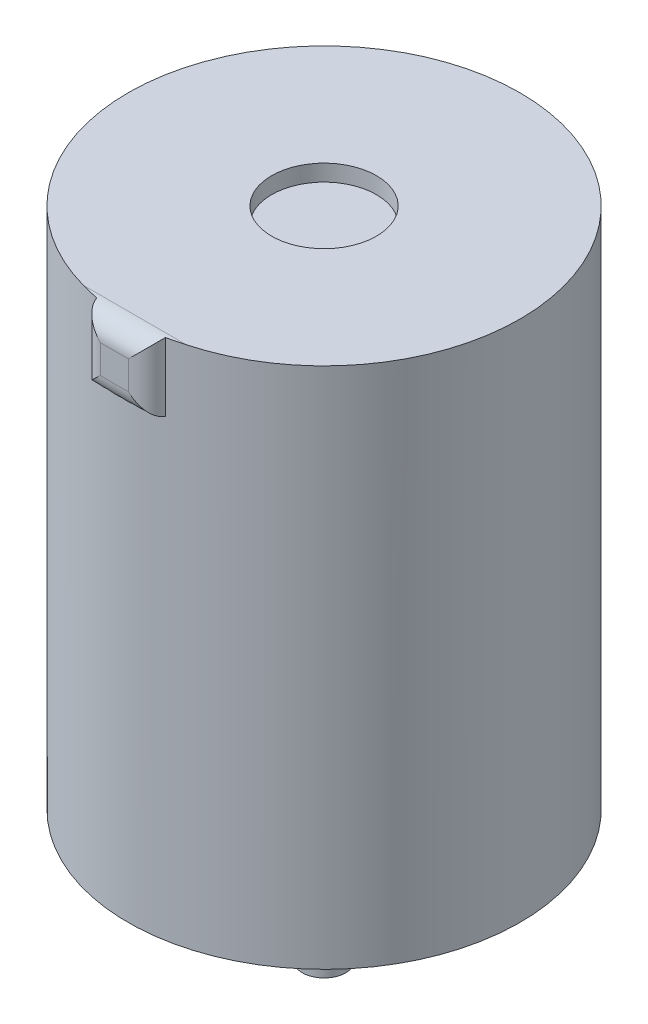
ISO-10303-21;
HEADER;
FILE_DESCRIPTION(('STEP AP214'),'2;1');
FILE_NAME('part.step','',(''),(''),'','','');
FILE_SCHEMA(('AUTOMOTIVE_DESIGN { 1 0 10303 214 1 1 1 1 }'));
ENDSEC;
DATA;
#1=APPLICATION_CONTEXT('core data for automotive mechanical design processes');
#2=APPLICATION_PROTOCOL_DEFINITION('international standard','automotive_design',2000,#1);
#3=PRODUCT_CONTEXT('',#1,'mechanical');
#4=PRODUCT('Part','Part','',(#3));
#5=PRODUCT_RELATED_PRODUCT_CATEGORY('part','',(#4));
#6=PRODUCT_DEFINITION_FORMATION('','',#4);
#7=PRODUCT_DEFINITION_CONTEXT('part definition',#1,'design');
#8=PRODUCT_DEFINITION('design','',#6,#7);
#9=PRODUCT_DEFINITION_SHAPE('','',#8);
#10=(LENGTH_UNIT() NAMED_UNIT(*) SI_UNIT(.MILLI.,.METRE.));
#11=(NAMED_UNIT(*) PLANE_ANGLE_UNIT() SI_UNIT($,.RADIAN.));
#12=(NAMED_UNIT(*) SI_UNIT($,.STERADIAN.) SOLID_ANGLE_UNIT());
#13=UNCERTAINTY_MEASURE_WITH_UNIT(LENGTH_MEASURE(1.E-05),#10,'distance_accuracy_value','');
#14=(GEOMETRIC_REPRESENTATION_CONTEXT(3) GLOBAL_UNCERTAINTY_ASSIGNED_CONTEXT((#13)) GLOBAL_UNIT_ASSIGNED_CONTEXT((#10,
#11,#12)) REPRESENTATION_CONTEXT('',''));
#15=CARTESIAN_POINT('',(0.,0.,0.));
#16=DIRECTION('',(0.,0.,1.));
#17=DIRECTION('',(1.,0.,0.));
#18=AXIS2_PLACEMENT_3D('',#15,#16,#17);
#19=CARTESIAN_POINT('',(0.,0.,0.));
#20=DIRECTION('',(0.,-1.,0.));
#21=DIRECTION('',(0.,0.,-1.));
#22=AXIS2_PLACEMENT_3D('',#19,#20,#21);
#23=CYLINDRICAL_SURFACE('',#22,28.575);
#24=CARTESIAN_POINT('',(0.,0.,0.));
#25=DIRECTION('',(0.,-1.,0.));
#26=DIRECTION('',(0.,0.,-1.));
#27=AXIS2_PLACEMENT_3D('',#24,#25,#26);
#28=CIRCLE('',#27,28.575);
#29=CARTESIAN_POINT('',(0.,0.,-28.575));
#30=VERTEX_POINT('',#29);
#31=EDGE_CURVE('E144',#30,#30,#28,.T.);
#32=ORIENTED_EDGE('',*,*,#31,.F.);
#33=EDGE_LOOP('',(#32));
#34=FACE_BOUND('',#33,.T.);
#35=DIRECTION('',(0.,-1.,0.));
#36=VECTOR('',#35,1.);
#37=CARTESIAN_POINT('',(-5.00000000000001,0.,28.1341540658325));
#38=LINE('',#37,#36);
#39=CARTESIAN_POINT('',(-5.,66.2,28.1341540658325));
#40=VERTEX_POINT('',#39);
#41=CARTESIAN_POINT('',(-5.00000000000001,76.1474305302522,28.1341540658325));
#42=VERTEX_POINT('',#41);
#43=EDGE_CURVE('E246',#40,#42,#38,.F.);
#44=ORIENTED_EDGE('',*,*,#43,.T.);
#45=CARTESIAN_POINT('',(-5.,76.1474305302522,28.1341540658325));
#46=CARTESIAN_POINT('',(-5.20971837423172,76.1544925742867,28.0968831383214));
#47=CARTESIAN_POINT('',(-5.41903135933657,76.1612847306028,28.0572648179616));
#48=CARTESIAN_POINT('',(-5.83663215046518,76.173736282968,27.9733744695855));
#49=CARTESIAN_POINT('',(-6.04492047133659,76.1793963203412,27.9291050981064));
#50=CARTESIAN_POINT('',(-6.46049848546486,76.1890000690684,27.8359107874363));
#51=CARTESIAN_POINT('',(-6.66778816689438,76.1929437601442,27.7869857932484));
#52=CARTESIAN_POINT('',(-7.08136815925299,76.1984385151618,27.684477143523));
#53=CARTESIAN_POINT('',(-7.28765783466425,76.1999882168806,27.6308908539277));
#54=CARTESIAN_POINT('',(-7.49333036773368,76.2,27.575));
#55=B_SPLINE_CURVE_WITH_KNOTS('',3,(#45,#46,#47,#48,#49,#50,#51,#52,#53,#54),.UNSPECIFIED.,.F.,
.F.,(4,2,2,2,4),(0.,0.639355095912037,1.27834697696316,1.91734640736193,2.55670930619054),.UNSPECIFIED.);
#56=CARTESIAN_POINT('',(-7.49333036773368,76.2,27.575));
#57=VERTEX_POINT('',#56);
#58=EDGE_CURVE('E52',#42,#57,#55,.T.);
#59=ORIENTED_EDGE('',*,*,#58,.T.);
#60=CARTESIAN_POINT('',(0.,76.2,0.));
#61=DIRECTION('',(0.,-1.,0.));
#62=DIRECTION('',(0.,0.,-1.));
#63=AXIS2_PLACEMENT_3D('',#60,#61,#62);
#64=CIRCLE('',#63,28.575);
#65=CARTESIAN_POINT('',(7.49333036773368,76.2,27.575));
#66=VERTEX_POINT('',#65);
#67=EDGE_CURVE('E142',#57,#66,#64,.T.);
#68=ORIENTED_EDGE('',*,*,#67,.T.);
#69=CARTESIAN_POINT('',(7.49333036773368,76.2,27.575));
#70=CARTESIAN_POINT('',(7.28765783466425,76.1999882168806,27.6308908539277));
#71=CARTESIAN_POINT('',(7.08136815925299,76.1984385151618,27.684477143523));
#72=CARTESIAN_POINT('',(6.66778816689438,76.1929437601442,27.7869857932484));
#73=CARTESIAN_POINT('',(6.46049848546486,76.1890000690684,27.8359107874363));
#74=CARTESIAN_POINT('',(6.04492047133659,76.1793963203412,27.9291050981064));
#75=CARTESIAN_POINT('',(5.83663215046517,76.173736282968,27.9733744695855));
#76=CARTESIAN_POINT('',(5.41903135933656,76.1612847306028,28.0572648179616));
#77=CARTESIAN_POINT('',(5.20971837423172,76.1544925742867,28.0968831383215));
#78=CARTESIAN_POINT('',(5.,76.1474305302522,28.1341540658325));
#79=B_SPLINE_CURVE_WITH_KNOTS('',3,(#69,#70,#71,#72,#73,#74,#75,#76,#77,#78),.UNSPECIFIED.,.F.,
.F.,(4,2,2,2,4),(0.,0.639362898828614,1.27836232922738,1.91735421027851,2.55670930619055),.UNSPECIFIED.);
#80=CARTESIAN_POINT('',(5.,76.1474305302522,28.1341540658325));
#81=VERTEX_POINT('',#80);
#82=EDGE_CURVE('E60',#66,#81,#79,.T.);
#83=ORIENTED_EDGE('',*,*,#82,.T.);
#84=DIRECTION('',(0.,-1.,0.));
#85=VECTOR('',#84,1.);
#86=CARTESIAN_POINT('',(5.,0.,28.1341540658325));
#87=LINE('',#86,#85);
#88=CARTESIAN_POINT('',(5.,66.2,28.1341540658325));
#89=VERTEX_POINT('',#88);
#90=EDGE_CURVE('E118',#81,#89,#87,.T.);
#91=ORIENTED_EDGE('',*,*,#90,.T.);
#92=CARTESIAN_POINT('',(0.,66.2,0.));
#93=DIRECTION('',(0.,-1.,0.));
#94=DIRECTION('',(0.,0.,-1.));
#95=AXIS2_PLACEMENT_3D('',#92,#93,#94);
#96=CIRCLE('',#95,28.575);
#97=EDGE_CURVE('E251',#89,#40,#96,.T.);
#98=ORIENTED_EDGE('',*,*,#97,.T.);
#99=EDGE_LOOP('',(#44,#59,#68,#83,#91,#98));
#100=FACE_BOUND('',#99,.T.);
#101=ADVANCED_FACE('F37',(#34,#100),#23,.T.);
#102=CARTESIAN_POINT('',(0.,-19.05,0.));
#103=DIRECTION('',(0.,-1.,0.));
#104=DIRECTION('',(0.,0.,-1.));
#105=AXIS2_PLACEMENT_3D('',#102,#103,#104);
#106=PLANE('',#105);
#107=CARTESIAN_POINT('',(0.,-19.05,0.));
#108=DIRECTION('',(0.,-1.,0.));
#109=DIRECTION('',(0.,0.,-1.));
#110=AXIS2_PLACEMENT_3D('',#107,#108,#109);
#111=CIRCLE('',#110,3.175);
#112=CARTESIAN_POINT('',(0.,-19.05,-3.175));
#113=VERTEX_POINT('',#112);
#114=EDGE_CURVE('E156',#113,#113,#111,.T.);
#115=ORIENTED_EDGE('',*,*,#114,.T.);
#116=EDGE_LOOP('',(#115));
#117=FACE_BOUND('',#116,.T.);
#118=ADVANCED_FACE('F237',(#117),#106,.T.);
#119=CARTESIAN_POINT('',(0.,0.,0.));
#120=DIRECTION('',(0.,-1.,0.));
#121=DIRECTION('',(0.,0.,-1.));
#122=AXIS2_PLACEMENT_3D('',#119,#120,#121);
#123=CYLINDRICAL_SURFACE('',#122,3.175);
#124=CARTESIAN_POINT('',(0.,2.4,0.));
#125=DIRECTION('',(0.,-1.,0.));
#126=DIRECTION('',(0.,0.,-1.));
#127=AXIS2_PLACEMENT_3D('',#124,#125,#126);
#128=CIRCLE('',#127,3.175);
#129=CARTESIAN_POINT('',(0.,2.4,-3.175));
#130=VERTEX_POINT('',#129);
#131=EDGE_CURVE('E153',#130,#130,#128,.T.);
#132=ORIENTED_EDGE('',*,*,#131,.T.);
#133=EDGE_LOOP('',(#132));
#134=FACE_BOUND('',#133,.T.);
#135=ORIENTED_EDGE('',*,*,#114,.F.);
#136=EDGE_LOOP('',(#135));
#137=FACE_BOUND('',#136,.T.);
#138=ADVANCED_FACE('F242',(#134,#137),#123,.T.);
#139=CARTESIAN_POINT('',(3.175,2.4,0.));
#140=DIRECTION('',(0.,-1.,0.));
#141=DIRECTION('',(0.,0.,-1.));
#142=AXIS2_PLACEMENT_3D('',#139,#140,#141);
#143=PLANE('',#142);
#144=CARTESIAN_POINT('',(0.,2.4,0.));
#145=DIRECTION('',(0.,-1.,0.));
#146=DIRECTION('',(0.,0.,-1.));
#147=AXIS2_PLACEMENT_3D('',#144,#145,#146);
#148=CIRCLE('',#147,7.645);
#149=CARTESIAN_POINT('',(0.,2.4,-7.645));
#150=VERTEX_POINT('',#149);
#151=EDGE_CURVE('E150',#150,#150,#148,.T.);
#152=ORIENTED_EDGE('',*,*,#151,.T.);
#153=EDGE_LOOP('',(#152));
#154=FACE_BOUND('',#153,.T.);
#155=ORIENTED_EDGE('',*,*,#131,.F.);
#156=EDGE_LOOP('',(#155));
#157=FACE_BOUND('',#156,.T.);
#158=ADVANCED_FACE('F315',(#154,#157),#143,.T.);
#159=CARTESIAN_POINT('',(0.,0.,0.));
#160=DIRECTION('',(0.,-1.,0.));
#161=DIRECTION('',(0.,0.,-1.));
#162=AXIS2_PLACEMENT_3D('',#159,#160,#161);
#163=CYLINDRICAL_SURFACE('',#162,7.645);
#164=CARTESIAN_POINT('',(0.,0.,0.));
#165=DIRECTION('',(0.,-1.,0.));
#166=DIRECTION('',(0.,0.,-1.));
#167=AXIS2_PLACEMENT_3D('',#164,#165,#166);
#168=CIRCLE('',#167,7.645);
#169=CARTESIAN_POINT('',(0.,0.,-7.645));
#170=VERTEX_POINT('',#169);
#171=EDGE_CURVE('E147',#170,#170,#168,.T.);
#172=ORIENTED_EDGE('',*,*,#171,.T.);
#173=EDGE_LOOP('',(#172));
#174=FACE_BOUND('',#173,.T.);
#175=ORIENTED_EDGE('',*,*,#151,.F.);
#176=EDGE_LOOP('',(#175));
#177=FACE_BOUND('',#176,.T.);
#178=ADVANCED_FACE('F270',(#174,#177),#163,.F.);
#179=CARTESIAN_POINT('',(7.645,0.,0.));
#180=DIRECTION('',(0.,-1.,0.));
#181=DIRECTION('',(0.,0.,-1.));
#182=AXIS2_PLACEMENT_3D('',#179,#180,#181);
#183=PLANE('',#182);
#184=CARTESIAN_POINT('',(18.4008869908067,0.,-4.93050280920323));
#185=DIRECTION('',(0.,-1.,0.));
#186=DIRECTION('',(0.,0.,-1.));
#187=AXIS2_PLACEMENT_3D('',#184,#185,#186);
#188=CIRCLE('',#187,1.35254999999999);
#189=CARTESIAN_POINT('',(18.4008869908067,0.,-6.28305280920321));
#190=VERTEX_POINT('',#189);
#191=EDGE_CURVE('E112',#190,#190,#188,.T.);
#192=ORIENTED_EDGE('',*,*,#191,.F.);
#193=EDGE_LOOP('',(#192));
#194=FACE_BOUND('',#193,.T.);
#195=CARTESIAN_POINT('',(4.93050280920303,0.,18.4008869908068));
#196=DIRECTION('',(0.,-1.,0.));
#197=DIRECTION('',(0.,0.,-1.));
#198=AXIS2_PLACEMENT_3D('',#195,#196,#197);
#199=CIRCLE('',#198,1.35254999999999);
#200=CARTESIAN_POINT('',(4.93050280920303,0.,17.0483369908068));
#201=VERTEX_POINT('',#200);
#202=EDGE_CURVE('E111',#201,#201,#199,.T.);
#203=ORIENTED_EDGE('',*,*,#202,.F.);
#204=EDGE_LOOP('',(#203));
#205=FACE_BOUND('',#204,.T.);
#206=CARTESIAN_POINT('',(-18.4008869908067,0.,4.9305028092031));
#207=DIRECTION('',(0.,-1.,0.));
#208=DIRECTION('',(0.,0.,-1.));
#209=AXIS2_PLACEMENT_3D('',#206,#207,#208);
#210=CIRCLE('',#209,1.35254999999999);
#211=CARTESIAN_POINT('',(-18.4008869908067,0.,3.57795280920311));
#212=VERTEX_POINT('',#211);
#213=EDGE_CURVE('E124',#212,#212,#210,.T.);
#214=ORIENTED_EDGE('',*,*,#213,.F.);
#215=EDGE_LOOP('',(#214));
#216=FACE_BOUND('',#215,.T.);
#217=CARTESIAN_POINT('',(-4.93050280920303,0.,-18.4008869908068));
#218=DIRECTION('',(0.,-1.,0.));
#219=DIRECTION('',(0.,0.,-1.));
#220=AXIS2_PLACEMENT_3D('',#217,#218,#219);
#221=CIRCLE('',#220,1.35254999999999);
#222=CARTESIAN_POINT('',(-4.93050280920303,0.,-19.7534369908067));
#223=VERTEX_POINT('',#222);
#224=EDGE_CURVE('E130',#223,#223,#221,.T.);
#225=ORIENTED_EDGE('',*,*,#224,.F.);
#226=EDGE_LOOP('',(#225));
#227=FACE_BOUND('',#226,.T.);
#228=ORIENTED_EDGE('',*,*,#31,.T.);
#229=EDGE_LOOP('',(#228));
#230=FACE_BOUND('',#229,.T.);
#231=ORIENTED_EDGE('',*,*,#171,.F.);
#232=EDGE_LOOP('',(#231));
#233=FACE_BOUND('',#232,.T.);
#234=ADVANCED_FACE('F261',(#194,#205,#216,#227,#230,#233),#183,.T.);
#235=CARTESIAN_POINT('',(28.575,76.2,0.));
#236=DIRECTION('',(0.,1.,0.));
#237=DIRECTION('',(0.,0.,1.));
#238=AXIS2_PLACEMENT_3D('',#235,#236,#237);
#239=PLANE('',#238);
#240=CARTESIAN_POINT('',(0.,76.2,0.));
#241=DIRECTION('',(0.,-1.,0.));
#242=DIRECTION('',(0.,0.,-1.));
#243=AXIS2_PLACEMENT_3D('',#240,#241,#242);
#244=CIRCLE('',#243,7.64499999999999);
#245=CARTESIAN_POINT('',(0.,76.2,-7.64499999999999));
#246=VERTEX_POINT('',#245);
#247=EDGE_CURVE('E139',#246,#246,#244,.T.);
#248=ORIENTED_EDGE('',*,*,#247,.T.);
#249=EDGE_LOOP('',(#248));
#250=FACE_BOUND('',#249,.T.);
#251=ORIENTED_EDGE('',*,*,#67,.F.);
#252=DIRECTION('',(-1.,0.,0.));
#253=VECTOR('',#252,1.);
#254=CARTESIAN_POINT('',(28.575,76.2,27.575));
#255=LINE('',#254,#253);
#256=EDGE_CURVE('E11',#57,#66,#255,.F.);
#257=ORIENTED_EDGE('',*,*,#256,.T.);
#258=EDGE_LOOP('',(#251,#257));
#259=FACE_BOUND('',#258,.T.);
#260=ADVANCED_FACE('F258',(#250,#259),#239,.T.);
#261=CARTESIAN_POINT('',(0.,0.,0.));
#262=DIRECTION('',(0.,-1.,0.));
#263=DIRECTION('',(0.,0.,-1.));
#264=AXIS2_PLACEMENT_3D('',#261,#262,#263);
#265=CYLINDRICAL_SURFACE('',#264,7.64499999999999);
#266=CARTESIAN_POINT('',(0.,73.8,0.));
#267=DIRECTION('',(0.,-1.,0.));
#268=DIRECTION('',(0.,0.,-1.));
#269=AXIS2_PLACEMENT_3D('',#266,#267,#268);
#270=CIRCLE('',#269,7.64499999999999);
#271=CARTESIAN_POINT('',(0.,73.8,-7.64499999999999));
#272=VERTEX_POINT('',#271);
#273=EDGE_CURVE('E136',#272,#272,#270,.T.);
#274=ORIENTED_EDGE('',*,*,#273,.T.);
#275=EDGE_LOOP('',(#274));
#276=FACE_BOUND('',#275,.T.);
#277=ORIENTED_EDGE('',*,*,#247,.F.);
#278=EDGE_LOOP('',(#277));
#279=FACE_BOUND('',#278,.T.);
#280=ADVANCED_FACE('F260',(#276,#279),#265,.F.);
#281=CARTESIAN_POINT('',(7.64499999999999,73.8,0.));
#282=DIRECTION('',(0.,1.,0.));
#283=DIRECTION('',(0.,0.,1.));
#284=AXIS2_PLACEMENT_3D('',#281,#282,#283);
#285=PLANE('',#284);
#286=ORIENTED_EDGE('',*,*,#273,.F.);
#287=EDGE_LOOP('',(#286));
#288=FACE_BOUND('',#287,.T.);
#289=ADVANCED_FACE('F267',(#288),#285,.T.);
#290=CARTESIAN_POINT('',(-4.93050280920303,7.62,-18.4008869908068));
#291=DIRECTION('',(0.,-1.,0.));
#292=DIRECTION('',(0.,0.,-1.));
#293=AXIS2_PLACEMENT_3D('',#290,#291,#292);
#294=CONICAL_SURFACE('',#293,1.35255,1.02974425867665);
#295=CARTESIAN_POINT('',(-4.93050280920303,8.43269403026573,-18.4008869908068));
#296=VERTEX_POINT('',#295);
#297=VERTEX_LOOP('',#296);
#298=FACE_BOUND('',#297,.T.);
#299=CARTESIAN_POINT('',(-4.93050280920303,7.62,-18.4008869908068));
#300=DIRECTION('',(0.,-1.,0.));
#301=DIRECTION('',(0.,0.,-1.));
#302=AXIS2_PLACEMENT_3D('',#299,#300,#301);
#303=CIRCLE('',#302,1.35255);
#304=CARTESIAN_POINT('',(-4.93050280920303,7.62,-19.7534369908067));
#305=VERTEX_POINT('',#304);
#306=EDGE_CURVE('E133',#305,#305,#303,.T.);
#307=ORIENTED_EDGE('',*,*,#306,.T.);
#308=EDGE_LOOP('',(#307));
#309=FACE_BOUND('',#308,.T.);
#310=ADVANCED_FACE('F275',(#298,#309),#294,.F.);
#311=CARTESIAN_POINT('',(-4.93050280920303,0.,-18.4008869908068));
#312=DIRECTION('',(0.,-1.,0.));
#313=DIRECTION('',(0.,0.,-1.));
#314=AXIS2_PLACEMENT_3D('',#311,#312,#313);
#315=CYLINDRICAL_SURFACE('',#314,1.35254999999999);
#316=ORIENTED_EDGE('',*,*,#306,.F.);
#317=EDGE_LOOP('',(#316));
#318=FACE_BOUND('',#317,.T.);
#319=ORIENTED_EDGE('',*,*,#224,.T.);
#320=EDGE_LOOP('',(#319));
#321=FACE_BOUND('',#320,.T.);
#322=ADVANCED_FACE('F279',(#318,#321),#315,.F.);
#323=CARTESIAN_POINT('',(-18.4008869908067,7.62,4.9305028092031));
#324=DIRECTION('',(0.,-1.,0.));
#325=DIRECTION('',(0.,0.,-1.));
#326=AXIS2_PLACEMENT_3D('',#323,#324,#325);
#327=CONICAL_SURFACE('',#326,1.35255,1.02974425867665);
#328=CARTESIAN_POINT('',(-18.4008869908067,8.43269403026573,4.9305028092031));
#329=VERTEX_POINT('',#328);
#330=VERTEX_LOOP('',#329);
#331=FACE_BOUND('',#330,.T.);
#332=CARTESIAN_POINT('',(-18.4008869908067,7.62,4.9305028092031));
#333=DIRECTION('',(0.,-1.,0.));
#334=DIRECTION('',(0.,0.,-1.));
#335=AXIS2_PLACEMENT_3D('',#332,#333,#334);
#336=CIRCLE('',#335,1.35255);
#337=CARTESIAN_POINT('',(-18.4008869908067,7.62,3.5779528092031));
#338=VERTEX_POINT('',#337);
#339=EDGE_CURVE('E127',#338,#338,#336,.T.);
#340=ORIENTED_EDGE('',*,*,#339,.T.);
#341=EDGE_LOOP('',(#340));
#342=FACE_BOUND('',#341,.T.);
#343=ADVANCED_FACE('F283',(#331,#342),#327,.F.);
#344=CARTESIAN_POINT('',(-18.4008869908067,0.,4.9305028092031));
#345=DIRECTION('',(0.,-1.,0.));
#346=DIRECTION('',(0.,0.,-1.));
#347=AXIS2_PLACEMENT_3D('',#344,#345,#346);
#348=CYLINDRICAL_SURFACE('',#347,1.35254999999999);
#349=ORIENTED_EDGE('',*,*,#339,.F.);
#350=EDGE_LOOP('',(#349));
#351=FACE_BOUND('',#350,.T.);
#352=ORIENTED_EDGE('',*,*,#213,.T.);
#353=EDGE_LOOP('',(#352));
#354=FACE_BOUND('',#353,.T.);
#355=ADVANCED_FACE('F287',(#351,#354),#348,.F.);
#356=CARTESIAN_POINT('',(4.93050280920303,7.62,18.4008869908068));
#357=DIRECTION('',(0.,-1.,0.));
#358=DIRECTION('',(0.,0.,-1.));
#359=AXIS2_PLACEMENT_3D('',#356,#357,#358);
#360=CONICAL_SURFACE('',#359,1.35255,1.02974425867665);
#361=CARTESIAN_POINT('',(4.93050280920303,8.43269403026573,18.4008869908068));
#362=VERTEX_POINT('',#361);
#363=VERTEX_LOOP('',#362);
#364=FACE_BOUND('',#363,.T.);
#365=CARTESIAN_POINT('',(4.93050280920303,7.62,18.4008869908068));
#366=DIRECTION('',(0.,-1.,0.));
#367=DIRECTION('',(0.,0.,-1.));
#368=AXIS2_PLACEMENT_3D('',#365,#366,#367);
#369=CIRCLE('',#368,1.35255);
#370=CARTESIAN_POINT('',(4.93050280920303,7.62,17.0483369908068));
#371=VERTEX_POINT('',#370);
#372=EDGE_CURVE('E115',#371,#371,#369,.T.);
#373=ORIENTED_EDGE('',*,*,#372,.T.);
#374=EDGE_LOOP('',(#373));
#375=FACE_BOUND('',#374,.T.);
#376=ADVANCED_FACE('F291',(#364,#375),#360,.F.);
#377=CARTESIAN_POINT('',(4.93050280920303,0.,18.4008869908068));
#378=DIRECTION('',(0.,-1.,0.));
#379=DIRECTION('',(0.,0.,-1.));
#380=AXIS2_PLACEMENT_3D('',#377,#378,#379);
#381=CYLINDRICAL_SURFACE('',#380,1.35254999999999);
#382=ORIENTED_EDGE('',*,*,#372,.F.);
#383=EDGE_LOOP('',(#382));
#384=FACE_BOUND('',#383,.T.);
#385=ORIENTED_EDGE('',*,*,#202,.T.);
#386=EDGE_LOOP('',(#385));
#387=FACE_BOUND('',#386,.T.);
#388=ADVANCED_FACE('F105',(#384,#387),#381,.F.);
#389=CARTESIAN_POINT('',(18.4008869908067,7.62,-4.93050280920323));
#390=DIRECTION('',(0.,-1.,0.));
#391=DIRECTION('',(0.,0.,-1.));
#392=AXIS2_PLACEMENT_3D('',#389,#390,#391);
#393=CONICAL_SURFACE('',#392,1.35255,1.02974425867665);
#394=CARTESIAN_POINT('',(18.4008869908067,8.43269403026573,-4.93050280920323));
#395=VERTEX_POINT('',#394);
#396=VERTEX_LOOP('',#395);
#397=FACE_BOUND('',#396,.T.);
#398=CARTESIAN_POINT('',(18.4008869908067,7.62,-4.93050280920323));
#399=DIRECTION('',(0.,-1.,0.));
#400=DIRECTION('',(0.,0.,-1.));
#401=AXIS2_PLACEMENT_3D('',#398,#399,#400);
#402=CIRCLE('',#401,1.35255);
#403=CARTESIAN_POINT('',(18.4008869908067,7.62,-6.28305280920322));
#404=VERTEX_POINT('',#403);
#405=EDGE_CURVE('E109',#404,#404,#402,.T.);
#406=ORIENTED_EDGE('',*,*,#405,.T.);
#407=EDGE_LOOP('',(#406));
#408=FACE_BOUND('',#407,.T.);
#409=ADVANCED_FACE('F101',(#397,#408),#393,.F.);
#410=CARTESIAN_POINT('',(18.4008869908067,0.,-4.93050280920323));
#411=DIRECTION('',(0.,-1.,0.));
#412=DIRECTION('',(0.,0.,-1.));
#413=AXIS2_PLACEMENT_3D('',#410,#411,#412);
#414=CYLINDRICAL_SURFACE('',#413,1.35254999999999);
#415=ORIENTED_EDGE('',*,*,#405,.F.);
#416=EDGE_LOOP('',(#415));
#417=FACE_BOUND('',#416,.T.);
#418=ORIENTED_EDGE('',*,*,#191,.T.);
#419=EDGE_LOOP('',(#418));
#420=FACE_BOUND('',#419,.T.);
#421=ADVANCED_FACE('F104',(#417,#420),#414,.F.);
#422=CARTESIAN_POINT('',(0.,0.,30.575));
#423=DIRECTION('',(0.,0.,1.));
#424=DIRECTION('',(1.,0.,0.));
#425=AXIS2_PLACEMENT_3D('',#422,#423,#424);
#426=PLANE('',#425);
#427=DIRECTION('',(0.,1.,0.));
#428=VECTOR('',#427,1.);
#429=CARTESIAN_POINT('',(2.05256946974776,76.2,30.575));
#430=LINE('',#429,#428);
#431=CARTESIAN_POINT('',(2.05256946974776,69.0542519304069,30.575));
#432=VERTEX_POINT('',#431);
#433=CARTESIAN_POINT('',(2.05256946974776,73.2,30.575));
#434=VERTEX_POINT('',#433);
#435=EDGE_CURVE('E159',#432,#434,#430,.T.);
#436=ORIENTED_EDGE('',*,*,#435,.T.);
#437=DIRECTION('',(-1.,0.,0.));
#438=VECTOR('',#437,1.);
#439=CARTESIAN_POINT('',(0.,73.2,30.575));
#440=LINE('',#439,#438);
#441=CARTESIAN_POINT('',(-2.05256946974777,73.2,30.575));
#442=VERTEX_POINT('',#441);
#443=EDGE_CURVE('E441',#434,#442,#440,.T.);
#444=ORIENTED_EDGE('',*,*,#443,.T.);
#445=DIRECTION('',(0.,1.,0.));
#446=VECTOR('',#445,1.);
#447=CARTESIAN_POINT('',(-2.05256946974777,66.2,30.575));
#448=LINE('',#447,#446);
#449=CARTESIAN_POINT('',(-2.05256946974777,69.0542519304069,30.575));
#450=VERTEX_POINT('',#449);
#451=EDGE_CURVE('E169',#442,#450,#448,.F.);
#452=ORIENTED_EDGE('',*,*,#451,.T.);
#453=CARTESIAN_POINT('',(7.25924818882755,69.1993901081454,30.575));
#454=CARTESIAN_POINT('',(7.27435318541518,66.2573659814702,30.575));
#455=CARTESIAN_POINT('',(7.27464771493535,66.2,27.6334964422453));
#456=CARTESIAN_POINT('',(6.95652404643565,69.1977987174268,30.575));
#457=CARTESIAN_POINT('',(6.99325892127903,66.3283470428306,30.575));
#458=CARTESIAN_POINT('',(6.99095806182228,66.2,27.7081914422044));
#459=CARTESIAN_POINT('',(6.65384126869476,69.1934014727065,30.575));
#460=CARTESIAN_POINT('',(6.70384930146924,66.3913990692042,30.575));
#461=CARTESIAN_POINT('',(6.70382686653787,66.2,27.7790966755273));
#462=CARTESIAN_POINT('',(6.04858102078938,69.1807760558114,30.575));
#463=CARTESIAN_POINT('',(6.11901802303128,66.502317263721,30.575));
#464=CARTESIAN_POINT('',(6.12340225562389,66.2,27.9127760985456));
#465=CARTESIAN_POINT('',(5.74600354329147,69.1725482525377,30.575));
#466=CARTESIAN_POINT('',(5.82282536618827,66.5506583940507,30.575));
#467=CARTESIAN_POINT('',(5.83010943598467,66.2,27.97555107048));
#468=CARTESIAN_POINT('',(5.14084495895726,69.1540392675035,30.575));
#469=CARTESIAN_POINT('',(5.22623322206992,66.6350694177809,30.575));
#470=CARTESIAN_POINT('',(5.23795589476661,66.2,28.0924471982494));
#471=CARTESIAN_POINT('',(4.83826386896607,69.1437575892607,30.575));
#472=CARTESIAN_POINT('',(4.9250404608351,66.671462479044,30.575));
#473=CARTESIAN_POINT('',(4.93909384280827,66.2,28.1465662559868));
#474=CARTESIAN_POINT('',(4.2331121538787,69.1226817106874,30.575));
#475=CARTESIAN_POINT('',(4.31975814669373,66.7343546181745,30.575));
#476=CARTESIAN_POINT('',(4.33661129524594,66.2,28.2456654270311));
#477=CARTESIAN_POINT('',(3.9305415292118,69.1118874979838,30.575));
#478=CARTESIAN_POINT('',(4.01487018871611,66.7610741316803,30.575));
#479=CARTESIAN_POINT('',(4.03299068488376,66.2,28.2906453195699));
#480=CARTESIAN_POINT('',(3.32570289851074,69.0911576769169,30.575));
#481=CARTESIAN_POINT('',(3.40351222327605,66.8064965782671,30.575));
#482=CARTESIAN_POINT('',(3.42214686890423,66.2,28.371012123259));
#483=CARTESIAN_POINT('',(3.02343492542627,69.0812211377947,30.575));
#484=CARTESIAN_POINT('',(3.09624942942471,66.8253533289388,30.575));
#485=CARTESIAN_POINT('',(3.1149279902238,66.2,28.406409524929));
#486=CARTESIAN_POINT('',(2.41884112355899,69.0633191359397,30.575));
#487=CARTESIAN_POINT('',(2.48059465226554,66.8565642691328,30.575));
#488=CARTESIAN_POINT('',(2.49745025860287,66.2,28.4673428604393));
#489=CARTESIAN_POINT('',(2.11651529533419,69.0553536550691,30.575));
#490=CARTESIAN_POINT('',(2.17140347308732,66.8690104132984,30.575));
#491=CARTESIAN_POINT('',(2.18719143366341,66.2,28.4928788850255));
#492=CARTESIAN_POINT('',(1.5118436149352,69.0422505888274,30.575));
#493=CARTESIAN_POINT('',(1.55261649461202,66.8884568944968,30.575));
#494=CARTESIAN_POINT('',(1.5646379618589,66.2,28.5338365752696));
#495=CARTESIAN_POINT('',(1.20949777185186,69.0371125980332,30.575));
#496=CARTESIAN_POINT('',(1.24222109566236,66.895511390494,30.575));
#497=CARTESIAN_POINT('',(1.25234361336088,66.2,28.54925969104));
#498=CARTESIAN_POINT('',(0.604767789092689,69.0302011566312,30.575));
#499=CARTESIAN_POINT('',(0.621617280259356,66.9048243928805,30.575));
#500=CARTESIAN_POINT('',(0.626699320350499,66.2,28.5698412967498));
#501=CARTESIAN_POINT('',(0.302383649653144,69.028427686188,30.575));
#502=CARTESIAN_POINT('',(0.310608264886595,66.907107296824,30.575));
#503=CARTESIAN_POINT('',(0.313349382072207,66.2,28.5749998472034));
#504=CARTESIAN_POINT('',(-0.250034466506376,69.0284266605021,30.575));
#505=CARTESIAN_POINT('',(-0.256835180737672,66.9071063548171,30.575));
#506=CARTESIAN_POINT('',(-0.25910173909507,66.2,28.5750001263442));
#507=CARTESIAN_POINT('',(-0.500068598132241,69.0296383831795,30.575));
#508=CARTESIAN_POINT('',(-0.513896513133292,66.9055450087429,30.575));
#509=CARTESIAN_POINT('',(-0.518203107101392,66.2,28.5714733135332));
#510=CARTESIAN_POINT('',(-1.00012353304285,69.0343871548686,30.575));
#511=CARTESIAN_POINT('',(-1.02722740310267,66.8992047270071,30.575));
#512=CARTESIAN_POINT('',(-1.03581824728334,66.2,28.5573943247502));
#513=CARTESIAN_POINT('',(-1.25014433551607,69.0379242881584,30.575));
#514=CARTESIAN_POINT('',(-1.28394959865401,66.8944143752826,30.575));
#515=CARTESIAN_POINT('',(-1.29433199782162,66.2,28.5468418941538));
#516=CARTESIAN_POINT('',(-2.00017672146815,69.0516953758032,30.575));
#517=CARTESIAN_POINT('',(-2.05378682980934,66.8748064058761,30.575));
#518=CARTESIAN_POINT('',(-2.06812341650324,66.2,28.5047388370663));
#519=CARTESIAN_POINT('',(-2.50012881306685,69.0650889734048,30.575));
#520=CARTESIAN_POINT('',(-2.56653893808246,66.8546674548056,30.575));
#521=CARTESIAN_POINT('',(-2.58162057767235,66.2,28.4627424579934));
#522=CARTESIAN_POINT('',(-3.39383123745648,69.0931592144266,30.575));
#523=CARTESIAN_POINT('',(-3.47341043048772,66.8025740194104,30.575));
#524=CARTESIAN_POINT('',(-3.49153189152099,66.2,28.3637567622471));
#525=CARTESIAN_POINT('',(-3.78761225480079,69.1069609533099,30.575));
#526=CARTESIAN_POINT('',(-3.87271555838625,66.7737073488803,30.575));
#527=CARTESIAN_POINT('',(-3.88967547517306,66.2,28.3118378475377));
#528=CARTESIAN_POINT('',(-4.57516071554715,69.1346423889158,30.575));
#529=CARTESIAN_POINT('',(-4.66401342889772,66.7012918015463,30.575));
#530=CARTESIAN_POINT('',(-4.67842473329848,66.2,28.192234207649));
#531=CARTESIAN_POINT('',(-4.96892815905335,69.1485220838425,30.575));
#532=CARTESIAN_POINT('',(-5.05776947678741,66.6573278183872,30.575));
#533=CARTESIAN_POINT('',(-5.06903058050096,66.2,28.1245498442045));
#534=CARTESIAN_POINT('',(-5.75654669384676,69.173083019129,30.575));
#535=CARTESIAN_POINT('',(-5.83545564482415,66.5501809113798,30.575));
#536=CARTESIAN_POINT('',(-5.8409971761296,66.2,27.9744144454517));
#537=CARTESIAN_POINT('',(-6.15039777433865,69.183764548838,30.575));
#538=CARTESIAN_POINT('',(-6.22113390402631,66.4863042572993,30.575));
#539=CARTESIAN_POINT('',(-6.22235875804598,66.2,27.8919647470943));
#540=CARTESIAN_POINT('',(-6.93828423180093,69.1979466091989,30.575));
#541=CARTESIAN_POINT('',(-6.9784879694512,66.3336227904973,30.575));
#542=CARTESIAN_POINT('',(-6.97441787807852,66.2,27.7134988926945));
#543=CARTESIAN_POINT('',(-7.3323196287406,69.2014459157434,30.575));
#544=CARTESIAN_POINT('',(-7.35184957358034,66.2436827815454,30.575));
#545=CARTESIAN_POINT('',(-7.34511358773536,66.2,27.6174804270295));
#546=CARTESIAN_POINT('',(-7.72641257694003,69.1993591539923,30.575));
#547=CARTESIAN_POINT('',(-7.70934349953904,66.1390947273106,30.575));
#548=CARTESIAN_POINT('',(-7.70968320770432,66.2,27.5152941077656));
#549=(BOUNDED_SURFACE() B_SPLINE_SURFACE(3,2,((#453,#454,#455),(#456,#457,#458),(#459,#460,
#461),(#462,#463,#464),(#465,#466,#467),(#468,#469,#470),(#471,#472,#473),(#474,#475,#476),
(#477,#478,#479),(#480,#481,#482),(#483,#484,#485),(#486,#487,#488),(#489,#490,#491),(#492,#493,
#494),(#495,#496,#497),(#498,#499,#500),(#501,#502,#503),(#504,#505,#506),(#507,#508,#509),
(#510,#511,#512),(#513,#514,#515),(#516,#517,#518),(#519,#520,#521),(#522,#523,#524),(#525,#526,
#527),(#528,#529,#530),(#531,#532,#533),(#534,#535,#536),(#537,#538,#539),(#540,#541,#542),
(#543,#544,#545),(#546,#547,#548)),.UNSPECIFIED.,.F.,.F.,.F.) B_SPLINE_SURFACE_WITH_KNOTS((4,2,
2,2,2,2,2,2,2,2,2,2,2,2,2,4),(3,3),(0.,0.90813493736929,1.81618243510639,2.72444970102798,
3.63273890468389,4.54002969186297,5.44731212980299,6.35446444203254,7.26161140618597,
8.01171151075562,8.76183880214283,10.2621817827715,11.4442501798226,12.626291457236,
13.8082257588926,14.9903614876671),(0.,1.),
.UNSPECIFIED.) GEOMETRIC_REPRESENTATION_ITEM() RATIONAL_B_SPLINE_SURFACE(((1.,0.713967371131826,
1.),(1.,0.722681779653688,1.),(1.,0.730802002095104,1.),(1.,0.745891689140927,1.),(1.,
0.752861264470592,1.),(1.,0.765690487265867,1.),(1.,0.7715498656954,1.),(1.,0.782180235599382,
1.),(1.,0.786951200782177,1.),(1.,0.795415954584411,1.),(1.,0.799110921501195,1.),(1.,
0.8054401460712,1.),(1.,0.808074413485163,1.),(1.,0.812287219021663,1.),(1.,0.813865908506505,
1.),(1.,0.815970585106259,1.),(1.,0.816496578427275,1.),(1.,0.816496582995294,1.),(1.,
0.816136950590353,1.),(1.,0.814697972380427,1.),(1.,0.813618600490441,1.),(1.,0.809299544660723,
1.),(1.,0.804978920391407,1.),(1.,0.794656929092705,1.),(1.,0.789206538377185,1.),(1.,
0.776474575915185,1.),(1.,0.769193046183497,1.),(1.,0.752753546064831,1.),(1.,0.743595745556992,
1.),(1.,0.723312980902876,1.),(1.,0.712187681775426,1.),(1.,0.700035011953644,1.))) REPRESENTATION_ITEM('') SURFACE());
#550=CARTESIAN_POINT('',(-7.72641257694003,69.1993591539923,30.575));
#551=CARTESIAN_POINT('',(-7.3323196287406,69.2014459157434,30.575));
#552=CARTESIAN_POINT('',(-6.93828423180093,69.1979466091989,30.575));
#553=CARTESIAN_POINT('',(-6.15039777433865,69.183764548838,30.575));
#554=CARTESIAN_POINT('',(-5.75654669384676,69.173083019129,30.575));
#555=CARTESIAN_POINT('',(-4.96892815905335,69.1485220838425,30.575));
#556=CARTESIAN_POINT('',(-4.57516071554715,69.1346423889158,30.575));
#557=CARTESIAN_POINT('',(-3.78761225480079,69.1069609533099,30.575));
#558=CARTESIAN_POINT('',(-3.39383123745648,69.0931592144266,30.575));
#559=CARTESIAN_POINT('',(-2.50012881306685,69.0650889734048,30.575));
#560=CARTESIAN_POINT('',(-2.00017672146815,69.0516953758032,30.575));
#561=CARTESIAN_POINT('',(-1.25014433551607,69.0379242881584,30.575));
#562=CARTESIAN_POINT('',(-1.00012353304285,69.0343871548686,30.575));
#563=CARTESIAN_POINT('',(-0.500068598132241,69.0296383831795,30.575));
#564=CARTESIAN_POINT('',(-0.250034466506376,69.0284266605022,30.575));
#565=CARTESIAN_POINT('',(0.302383649653144,69.028427686188,30.575));
#566=CARTESIAN_POINT('',(0.604767789092689,69.0302011566312,30.575));
#567=CARTESIAN_POINT('',(1.20949777185186,69.0371125980332,30.575));
#568=CARTESIAN_POINT('',(1.51184361493519,69.0422505888274,30.575));
#569=CARTESIAN_POINT('',(2.11651529533419,69.0553536550691,30.575));
#570=CARTESIAN_POINT('',(2.41884112355899,69.0633191359397,30.575));
#571=CARTESIAN_POINT('',(3.02343492542627,69.0812211377947,30.575));
#572=CARTESIAN_POINT('',(3.32570289851074,69.0911576769169,30.575));
#573=CARTESIAN_POINT('',(3.9305415292118,69.1118874979838,30.575));
#574=CARTESIAN_POINT('',(4.2331121538787,69.1226817106874,30.575));
#575=CARTESIAN_POINT('',(4.83826386896607,69.1437575892607,30.575));
#576=CARTESIAN_POINT('',(5.14084495895726,69.1540392675035,30.575));
#577=CARTESIAN_POINT('',(5.74600354329147,69.1725482525377,30.575));
#578=CARTESIAN_POINT('',(6.04858102078938,69.1807760558114,30.575));
#579=CARTESIAN_POINT('',(6.65384126869476,69.1934014727065,30.575));
#580=CARTESIAN_POINT('',(6.95652404643566,69.1977987174268,30.575));
#581=CARTESIAN_POINT('',(7.25924818882755,69.1993901081454,30.575));
#582=B_SPLINE_CURVE_WITH_KNOTS('',3,(#550,#551,#552,#553,#554,#555,#556,#557,#558,#559,#560,
#561,#562,#563,#564,#565,#566,#567,#568,#569,#570,#571,#572,#573,#574,#575,#576,#577,#578,#579,
#580,#581),.UNSPECIFIED.,.F.,.F.,(4,2,2,2,2,2,2,2,2,2,2,2,2,2,2,4),(0.,1.1821357287745,
2.36407003043102,3.54611130784441,4.72817970489556,6.22852268552422,6.97864997691143,
7.72875008148109,8.63589704563451,9.54304935786406,10.4503317958041,11.3576225829832,
12.2659117866391,13.1741790525607,14.0822265502978,14.9903614876671),.UNSPECIFIED.);
#583=EDGE_CURVE('E161',#450,#432,#582,.T.);
#584=ORIENTED_EDGE('',*,*,#583,.T.);
#585=EDGE_LOOP('',(#436,#444,#452,#584));
#586=FACE_BOUND('',#585,.T.);
#587=ADVANCED_FACE('F174',(#586),#426,.T.);
#588=CARTESIAN_POINT('',(-5.,66.2,28.1341540658325));
#589=CARTESIAN_POINT('',(-4.9858544456309,66.2136771494464,28.2088018976176));
#590=CARTESIAN_POINT('',(-4.9689419922774,66.2300278048019,28.2823881455178));
#591=CARTESIAN_POINT('',(-4.93006280816254,66.2676104916071,28.4268162905377));
#592=CARTESIAN_POINT('',(-4.90810350971742,66.2888353449561,28.4976620459878));
#593=CARTESIAN_POINT('',(-4.85980103656178,66.3355163508798,28.6355389108022));
#594=CARTESIAN_POINT('',(-4.83350235681592,66.3609295543036,28.7026003082361));
#595=CARTESIAN_POINT('',(-4.77684695333744,66.4156686408379,28.8333290238788));
#596=CARTESIAN_POINT('',(-4.74648879163103,66.444995910405,28.8969951281564));
#597=CARTESIAN_POINT('',(-4.65040915662413,66.5378032661898,29.0817859170474));
#598=CARTESIAN_POINT('',(-4.57934944361111,66.6064308070687,29.1976246484366));
#599=CARTESIAN_POINT('',(-4.42617335271992,66.7543378462152,29.4144900914187));
#600=CARTESIAN_POINT('',(-4.34402586388835,66.8336473152935,29.5154733912102));
#601=CARTESIAN_POINT('',(-4.12419207793628,67.0458886886888,29.7537966197097));
#602=CARTESIAN_POINT('',(-3.98069926366458,67.1844278054752,29.8808215916402));
#603=CARTESIAN_POINT('',(-3.68095793723292,67.4739651019481,30.1014841016112));
#604=CARTESIAN_POINT('',(-3.52467954382539,67.624992477364,30.1950405130233));
#605=CARTESIAN_POINT('',(-3.2598133238654,67.881229037031,30.3238389941755));
#606=CARTESIAN_POINT('',(-3.15337244640298,67.9842702805089,30.3680640471738));
#607=CARTESIAN_POINT('',(-2.93823630038235,68.1927377338324,30.4435556611716));
#608=CARTESIAN_POINT('',(-2.82954001660373,68.2981650197271,30.4748162475461));
#609=CARTESIAN_POINT('',(-2.50192294854115,68.6162809766372,30.5495803880945));
#610=CARTESIAN_POINT('',(-2.28073450950191,68.8315185017229,30.5744141860508));
#611=CARTESIAN_POINT('',(-2.05779581170434,69.0491497218516,30.5749965835478));
#612=CARTESIAN_POINT('',(-2.05518257676185,69.0517008401785,30.574999997661));
#613=CARTESIAN_POINT('',(-2.05256946974778,69.0542519304069,30.575));
#614=B_SPLINE_CURVE_WITH_KNOTS('',3,(#588,#589,#590,#591,#592,#593,#594,#595,#596,#597,#598,
#599,#600,#601,#602,#603,#604,#605,#606,#607,#608,#609,#610,#611,#612,#613),.UNSPECIFIED.,.F.,
.F.,(4,2,2,2,2,2,2,2,2,2,2,2,4),(0.,0.231423424307888,0.46250819863093,0.691356004899997,
0.920285090805949,1.37508670836254,1.83119205355965,2.53670651704855,3.24391971697038,
3.70715425413827,4.17060203458844,5.09427720247595,5.10523323854104),.UNSPECIFIED.);
#615=EDGE_CURVE('E205',#40,#450,#614,.T.);
#616=ORIENTED_EDGE('',*,*,#615,.F.);
#617=ORIENTED_EDGE('',*,*,#97,.F.);
#618=CARTESIAN_POINT('',(5.,66.2,28.1341540658325));
#619=CARTESIAN_POINT('',(4.98585439950405,66.213676622555,28.208802065202));
#620=CARTESIAN_POINT('',(4.968941929006,66.2300270758734,28.2823883921292));
#621=CARTESIAN_POINT('',(4.93006271850473,66.2676095092701,28.4268166121896));
#622=CARTESIAN_POINT('',(4.90810341456493,66.2888343073975,28.4976623656372));
#623=CARTESIAN_POINT('',(4.85980085968244,66.3355148861285,28.6355393680639));
#624=CARTESIAN_POINT('',(4.83350210300027,66.3609277219937,28.7026009030362));
#625=CARTESIAN_POINT('',(4.77684676237643,66.415667323722,28.8333294553553));
#626=CARTESIAN_POINT('',(4.74648873935566,66.4449954776262,28.8969952576077));
#627=CARTESIAN_POINT('',(4.65040928555622,66.5378041017436,29.0817856116379));
#628=CARTESIAN_POINT('',(4.57934936604522,66.6064306905693,29.1976247242837));
#629=CARTESIAN_POINT('',(4.42617319948106,66.7543372449929,29.414490342414));
#630=CARTESIAN_POINT('',(4.34402584250571,66.833647185418,29.5154734345012));
#631=CARTESIAN_POINT('',(4.12419210843774,67.0458888920681,29.7537965555363));
#632=CARTESIAN_POINT('',(3.98069905995685,67.1844273955797,29.8808218559959));
#633=CARTESIAN_POINT('',(3.68095711856665,67.4739638795778,30.1014845895522));
#634=CARTESIAN_POINT('',(3.52467834413647,67.6249910567178,30.1950408951952));
#635=CARTESIAN_POINT('',(3.25981409019869,67.8812299864194,30.3238387533202));
#636=CARTESIAN_POINT('',(3.15337465666229,67.9842728744809,30.3680634443658));
#637=CARTESIAN_POINT('',(2.93823556525529,68.1927371223032,30.4435557463189));
#638=CARTESIAN_POINT('',(2.82953489028551,68.2981595542711,30.4748173881011));
#639=CARTESIAN_POINT('',(2.50191366116922,68.6162708650895,30.549582566251));
#640=CARTESIAN_POINT('',(2.28073443193449,68.8315183532505,30.5744142115152));
#641=CARTESIAN_POINT('',(2.0577958130073,69.049149723239,30.5749965832448));
#642=CARTESIAN_POINT('',(2.05518257807339,69.0517008415817,30.5749999973552));
#643=CARTESIAN_POINT('',(2.05256946974776,69.0542519304069,30.575));
#644=B_SPLINE_CURVE_WITH_KNOTS('',3,(#618,#619,#620,#621,#622,#623,#624,#625,#626,#627,#628,
#629,#630,#631,#632,#633,#634,#635,#636,#637,#638,#639,#640,#641,#642,#643),.UNSPECIFIED.,.F.,
.F.,(4,2,2,2,2,2,2,2,2,2,2,2,4),(0.,0.231423559581798,0.462508298547682,0.691356136565671,
0.920285321216798,1.37508695647299,1.83119231674929,2.53670681716258,3.24392004952499,
3.70715469404331,4.17060240905223,5.09427770998519,5.10523374606349),.UNSPECIFIED.);
#645=EDGE_CURVE('E42',#432,#89,#644,.F.);
#646=ORIENTED_EDGE('',*,*,#645,.F.);
#647=ORIENTED_EDGE('',*,*,#583,.F.);
#648=EDGE_LOOP('',(#616,#617,#646,#647));
#649=FACE_BOUND('',#648,.T.);
#650=ADVANCED_FACE('F178',(#649),#549,.T.);
#651=CARTESIAN_POINT('',(2.05256946974776,0.,27.575));
#652=DIRECTION('',(0.,-1.,0.));
#653=DIRECTION('',(0.,0.,-1.));
#654=AXIS2_PLACEMENT_3D('',#651,#652,#653);
#655=CYLINDRICAL_SURFACE('',#654,3.);
#656=ORIENTED_EDGE('',*,*,#645,.T.);
#657=ORIENTED_EDGE('',*,*,#90,.F.);
#658=CARTESIAN_POINT('',(2.05256946974776,73.2,27.575));
#659=DIRECTION('',(0.707106781186547,-0.707106781186547,0.));
#660=DIRECTION('',(-0.707106781186547,-0.707106781186547,0.));
#661=AXIS2_PLACEMENT_3D('',#658,#659,#660);
#662=ELLIPSE('',#661,4.24264068711928,3.);
#663=EDGE_CURVE('E212',#434,#81,#662,.F.);
#664=ORIENTED_EDGE('',*,*,#663,.F.);
#665=ORIENTED_EDGE('',*,*,#435,.F.);
#666=EDGE_LOOP('',(#656,#657,#664,#665));
#667=FACE_BOUND('',#666,.T.);
#668=ADVANCED_FACE('F39',(#667),#655,.T.);
#669=CARTESIAN_POINT('',(-2.05256946974777,0.,27.575));
#670=DIRECTION('',(0.,-1.,0.));
#671=DIRECTION('',(0.,0.,-1.));
#672=AXIS2_PLACEMENT_3D('',#669,#670,#671);
#673=CYLINDRICAL_SURFACE('',#672,3.);
#674=ORIENTED_EDGE('',*,*,#615,.T.);
#675=ORIENTED_EDGE('',*,*,#451,.F.);
#676=CARTESIAN_POINT('',(-2.05256946974777,73.2,27.575));
#677=DIRECTION('',(-0.707106781186547,-0.707106781186547,0.));
#678=DIRECTION('',(0.707106781186547,-0.707106781186547,0.));
#679=AXIS2_PLACEMENT_3D('',#676,#677,#678);
#680=ELLIPSE('',#679,4.24264068711928,3.);
#681=EDGE_CURVE('E214',#42,#442,#680,.F.);
#682=ORIENTED_EDGE('',*,*,#681,.F.);
#683=ORIENTED_EDGE('',*,*,#43,.F.);
#684=EDGE_LOOP('',(#674,#675,#682,#683));
#685=FACE_BOUND('',#684,.T.);
#686=ADVANCED_FACE('F188',(#685),#673,.T.);
#687=CARTESIAN_POINT('',(0.,73.2,27.575));
#688=DIRECTION('',(-1.,0.,0.));
#689=DIRECTION('',(0.,0.,1.));
#690=AXIS2_PLACEMENT_3D('',#687,#688,#689);
#691=CYLINDRICAL_SURFACE('',#690,3.);
#692=ORIENTED_EDGE('',*,*,#82,.F.);
#693=ORIENTED_EDGE('',*,*,#256,.F.);
#694=ORIENTED_EDGE('',*,*,#58,.F.);
#695=ORIENTED_EDGE('',*,*,#681,.T.);
#696=ORIENTED_EDGE('',*,*,#443,.F.);
#697=ORIENTED_EDGE('',*,*,#663,.T.);
#698=EDGE_LOOP('',(#692,#693,#694,#695,#696,#697));
#699=FACE_BOUND('',#698,.T.);
#700=ADVANCED_FACE('F228',(#699),#691,.T.);
#701=CLOSED_SHELL('',(#101,#118,#138,#158,#178,#234,#260,#280,#289,#310,#322,#343,#355,#376,
#388,#409,#421,#587,#650,#668,#686,#700));
#702=MANIFOLD_SOLID_BREP('B2',#701);
#703=ADVANCED_BREP_SHAPE_REPRESENTATION('',(#18,#702),#14);
#704=SHAPE_DEFINITION_REPRESENTATION(#9,#703);
ENDSEC;
END-ISO-10303-21;
